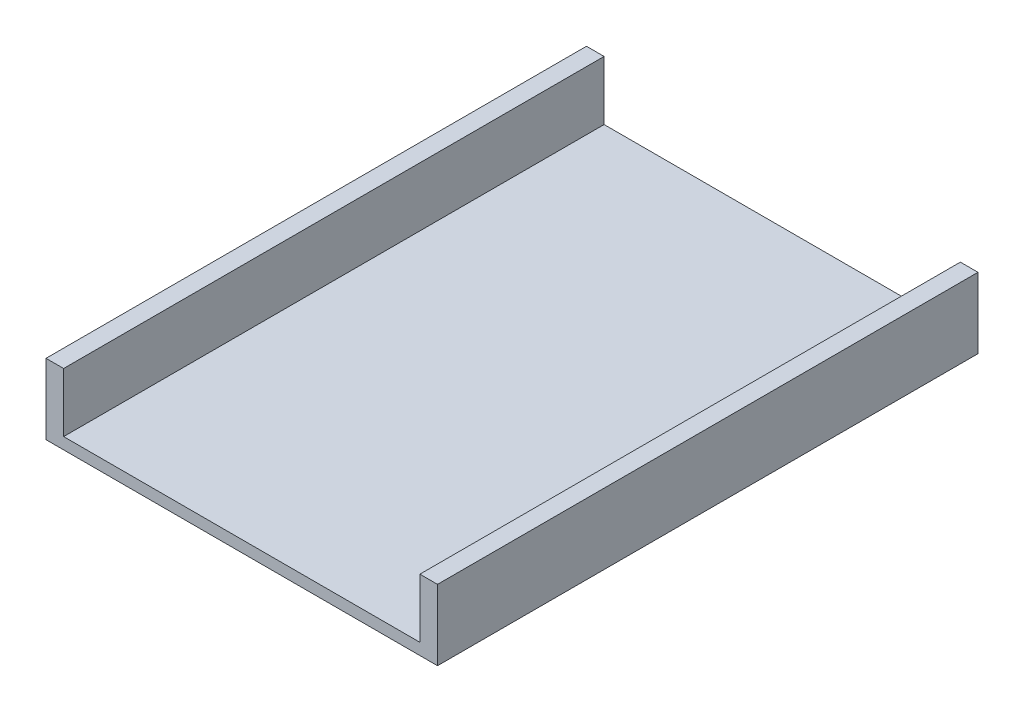
ISO-10303-21;
HEADER;
FILE_DESCRIPTION(('STEP AP214'),'2;1');
FILE_NAME('part.step','',(''),(''),'','','');
FILE_SCHEMA(('AUTOMOTIVE_DESIGN { 1 0 10303 214 1 1 1 1 }'));
ENDSEC;
DATA;
#1=APPLICATION_CONTEXT('core data for automotive mechanical design processes');
#2=APPLICATION_PROTOCOL_DEFINITION('international standard','automotive_design',2000,#1);
#3=PRODUCT_CONTEXT('',#1,'mechanical');
#4=PRODUCT('Part','Part','',(#3));
#5=PRODUCT_RELATED_PRODUCT_CATEGORY('part','',(#4));
#6=PRODUCT_DEFINITION_FORMATION('','',#4);
#7=PRODUCT_DEFINITION_CONTEXT('part definition',#1,'design');
#8=PRODUCT_DEFINITION('design','',#6,#7);
#9=PRODUCT_DEFINITION_SHAPE('','',#8);
#10=(LENGTH_UNIT() NAMED_UNIT(*) SI_UNIT(.MILLI.,.METRE.));
#11=(NAMED_UNIT(*) PLANE_ANGLE_UNIT() SI_UNIT($,.RADIAN.));
#12=(NAMED_UNIT(*) SI_UNIT($,.STERADIAN.) SOLID_ANGLE_UNIT());
#13=UNCERTAINTY_MEASURE_WITH_UNIT(LENGTH_MEASURE(1.E-05),#10,'distance_accuracy_value','');
#14=(GEOMETRIC_REPRESENTATION_CONTEXT(3) GLOBAL_UNCERTAINTY_ASSIGNED_CONTEXT((#13)) GLOBAL_UNIT_ASSIGNED_CONTEXT((#10,
#11,#12)) REPRESENTATION_CONTEXT('',''));
#15=CARTESIAN_POINT('',(0.,0.,0.));
#16=DIRECTION('',(0.,0.,1.));
#17=DIRECTION('',(1.,0.,0.));
#18=AXIS2_PLACEMENT_3D('',#15,#16,#17);
#19=CARTESIAN_POINT('',(-36.0467065868263,-19.449251497006,584.2));
#20=DIRECTION('',(1.,0.,0.));
#21=DIRECTION('',(0.,0.,-1.));
#22=AXIS2_PLACEMENT_3D('',#19,#20,#21);
#23=PLANE('',#22);
#24=DIRECTION('',(0.,-1.,0.));
#25=VECTOR('',#24,1.);
#26=CARTESIAN_POINT('',(-36.0467065868263,-19.449251497006,0.));
#27=LINE('',#26,#25);
#28=CARTESIAN_POINT('',(-36.0467065868263,56.750748502994,0.));
#29=VERTEX_POINT('',#28);
#30=CARTESIAN_POINT('',(-36.0467065868263,-19.449251497006,0.));
#31=VERTEX_POINT('',#30);
#32=EDGE_CURVE('E128',#29,#31,#27,.T.);
#33=ORIENTED_EDGE('',*,*,#32,.T.);
#34=DIRECTION('',(0.,0.,-1.));
#35=VECTOR('',#34,1.);
#36=CARTESIAN_POINT('',(-36.0467065868263,-19.449251497006,584.2));
#37=LINE('',#36,#35);
#38=CARTESIAN_POINT('',(-36.0467065868263,-19.449251497006,584.2));
#39=VERTEX_POINT('',#38);
#40=EDGE_CURVE('E11',#39,#31,#37,.T.);
#41=ORIENTED_EDGE('',*,*,#40,.F.);
#42=DIRECTION('',(0.,-1.,0.));
#43=VECTOR('',#42,1.);
#44=CARTESIAN_POINT('',(-36.0467065868263,-19.449251497006,584.2));
#45=LINE('',#44,#43);
#46=CARTESIAN_POINT('',(-36.0467065868263,56.750748502994,584.2));
#47=VERTEX_POINT('',#46);
#48=EDGE_CURVE('E142',#47,#39,#45,.T.);
#49=ORIENTED_EDGE('',*,*,#48,.F.);
#50=DIRECTION('',(0.,0.,-1.));
#51=VECTOR('',#50,1.);
#52=CARTESIAN_POINT('',(-36.0467065868263,56.750748502994,584.2));
#53=LINE('',#52,#51);
#54=EDGE_CURVE('E124',#47,#29,#53,.T.);
#55=ORIENTED_EDGE('',*,*,#54,.T.);
#56=EDGE_LOOP('',(#33,#41,#49,#55));
#57=FACE_BOUND('',#56,.T.);
#58=ADVANCED_FACE('F32',(#57),#23,.F.);
#59=CARTESIAN_POINT('',(65.3631736526946,-19.449251497006,584.2));
#60=DIRECTION('',(0.,1.,0.));
#61=DIRECTION('',(0.,0.,1.));
#62=AXIS2_PLACEMENT_3D('',#59,#60,#61);
#63=PLANE('',#62);
#64=DIRECTION('',(1.,0.,0.));
#65=VECTOR('',#64,1.);
#66=CARTESIAN_POINT('',(65.3631736526946,-19.449251497006,0.));
#67=LINE('',#66,#65);
#68=CARTESIAN_POINT('',(387.117293413174,-19.449251497006,0.));
#69=VERTEX_POINT('',#68);
#70=EDGE_CURVE('E131',#31,#69,#67,.T.);
#71=ORIENTED_EDGE('',*,*,#70,.T.);
#72=DIRECTION('',(0.,0.,-1.));
#73=VECTOR('',#72,1.);
#74=CARTESIAN_POINT('',(387.117293413174,-19.449251497006,584.2));
#75=LINE('',#74,#73);
#76=CARTESIAN_POINT('',(387.117293413174,-19.449251497006,584.2));
#77=VERTEX_POINT('',#76);
#78=EDGE_CURVE('E40',#77,#69,#75,.T.);
#79=ORIENTED_EDGE('',*,*,#78,.F.);
#80=DIRECTION('',(1.,0.,0.));
#81=VECTOR('',#80,1.);
#82=CARTESIAN_POINT('',(65.3631736526946,-19.449251497006,584.2));
#83=LINE('',#82,#81);
#84=EDGE_CURVE('E91',#39,#77,#83,.T.);
#85=ORIENTED_EDGE('',*,*,#84,.F.);
#86=ORIENTED_EDGE('',*,*,#40,.T.);
#87=EDGE_LOOP('',(#71,#79,#85,#86));
#88=FACE_BOUND('',#87,.T.);
#89=ADVANCED_FACE('F177',(#88),#63,.F.);
#90=CARTESIAN_POINT('',(387.117293413174,-19.449251497006,584.2));
#91=DIRECTION('',(-1.,0.,0.));
#92=DIRECTION('',(0.,0.,1.));
#93=AXIS2_PLACEMENT_3D('',#90,#91,#92);
#94=PLANE('',#93);
#95=DIRECTION('',(0.,1.,0.));
#96=VECTOR('',#95,1.);
#97=CARTESIAN_POINT('',(387.117293413174,-19.449251497006,0.));
#98=LINE('',#97,#96);
#99=CARTESIAN_POINT('',(387.117293413174,56.750748502994,0.));
#100=VERTEX_POINT('',#99);
#101=EDGE_CURVE('E133',#69,#100,#98,.T.);
#102=ORIENTED_EDGE('',*,*,#101,.T.);
#103=DIRECTION('',(0.,0.,-1.));
#104=VECTOR('',#103,1.);
#105=CARTESIAN_POINT('',(387.117293413174,56.750748502994,584.2));
#106=LINE('',#105,#104);
#107=CARTESIAN_POINT('',(387.117293413174,56.750748502994,584.2));
#108=VERTEX_POINT('',#107);
#109=EDGE_CURVE('E149',#108,#100,#106,.T.);
#110=ORIENTED_EDGE('',*,*,#109,.F.);
#111=DIRECTION('',(0.,1.,0.));
#112=VECTOR('',#111,1.);
#113=CARTESIAN_POINT('',(387.117293413174,-19.449251497006,584.2));
#114=LINE('',#113,#112);
#115=EDGE_CURVE('E157',#77,#108,#114,.T.);
#116=ORIENTED_EDGE('',*,*,#115,.F.);
#117=ORIENTED_EDGE('',*,*,#78,.T.);
#118=EDGE_LOOP('',(#102,#110,#116,#117));
#119=FACE_BOUND('',#118,.T.);
#120=ADVANCED_FACE('F155',(#119),#94,.F.);
#121=CARTESIAN_POINT('',(387.117293413174,56.750748502994,584.2));
#122=DIRECTION('',(0.,-1.,0.));
#123=DIRECTION('',(0.,0.,-1.));
#124=AXIS2_PLACEMENT_3D('',#121,#122,#123);
#125=PLANE('',#124);
#126=DIRECTION('',(-1.,0.,0.));
#127=VECTOR('',#126,1.);
#128=CARTESIAN_POINT('',(387.117293413174,56.750748502994,0.));
#129=LINE('',#128,#127);
#130=CARTESIAN_POINT('',(368.067293413174,56.750748502994,0.));
#131=VERTEX_POINT('',#130);
#132=EDGE_CURVE('E135',#100,#131,#129,.T.);
#133=ORIENTED_EDGE('',*,*,#132,.T.);
#134=DIRECTION('',(0.,0.,-1.));
#135=VECTOR('',#134,1.);
#136=CARTESIAN_POINT('',(368.067293413174,56.750748502994,584.2));
#137=LINE('',#136,#135);
#138=CARTESIAN_POINT('',(368.067293413174,56.750748502994,584.2));
#139=VERTEX_POINT('',#138);
#140=EDGE_CURVE('E146',#139,#131,#137,.T.);
#141=ORIENTED_EDGE('',*,*,#140,.F.);
#142=DIRECTION('',(-1.,0.,0.));
#143=VECTOR('',#142,1.);
#144=CARTESIAN_POINT('',(387.117293413174,56.750748502994,584.2));
#145=LINE('',#144,#143);
#146=EDGE_CURVE('E169',#108,#139,#145,.T.);
#147=ORIENTED_EDGE('',*,*,#146,.F.);
#148=ORIENTED_EDGE('',*,*,#109,.T.);
#149=EDGE_LOOP('',(#133,#141,#147,#148));
#150=FACE_BOUND('',#149,.T.);
#151=ADVANCED_FACE('F165',(#150),#125,.F.);
#152=CARTESIAN_POINT('',(368.067293413174,-7.00325149700598,584.2));
#153=DIRECTION('',(1.,0.,0.));
#154=DIRECTION('',(0.,0.,-1.));
#155=AXIS2_PLACEMENT_3D('',#152,#153,#154);
#156=PLANE('',#155);
#157=DIRECTION('',(0.,-1.,0.));
#158=VECTOR('',#157,1.);
#159=CARTESIAN_POINT('',(368.067293413174,-7.00325149700598,0.));
#160=LINE('',#159,#158);
#161=CARTESIAN_POINT('',(368.067293413174,-7.00325149700598,0.));
#162=VERTEX_POINT('',#161);
#163=EDGE_CURVE('E137',#131,#162,#160,.T.);
#164=ORIENTED_EDGE('',*,*,#163,.T.);
#165=DIRECTION('',(0.,0.,-1.));
#166=VECTOR('',#165,1.);
#167=CARTESIAN_POINT('',(368.067293413174,-7.00325149700598,584.2));
#168=LINE('',#167,#166);
#169=CARTESIAN_POINT('',(368.067293413174,-7.00325149700598,584.2));
#170=VERTEX_POINT('',#169);
#171=EDGE_CURVE('E119',#170,#162,#168,.T.);
#172=ORIENTED_EDGE('',*,*,#171,.F.);
#173=DIRECTION('',(0.,-1.,0.));
#174=VECTOR('',#173,1.);
#175=CARTESIAN_POINT('',(368.067293413174,-7.00325149700598,584.2));
#176=LINE('',#175,#174);
#177=EDGE_CURVE('E110',#139,#170,#176,.T.);
#178=ORIENTED_EDGE('',*,*,#177,.F.);
#179=ORIENTED_EDGE('',*,*,#140,.T.);
#180=EDGE_LOOP('',(#164,#172,#178,#179));
#181=FACE_BOUND('',#180,.T.);
#182=ADVANCED_FACE('F168',(#181),#156,.F.);
#183=CARTESIAN_POINT('',(-16.9967065868263,-7.00325149700598,584.2));
#184=DIRECTION('',(0.,-1.,0.));
#185=DIRECTION('',(0.,0.,-1.));
#186=AXIS2_PLACEMENT_3D('',#183,#184,#185);
#187=PLANE('',#186);
#188=DIRECTION('',(-1.,0.,0.));
#189=VECTOR('',#188,1.);
#190=CARTESIAN_POINT('',(-16.9967065868263,-7.00325149700598,0.));
#191=LINE('',#190,#189);
#192=CARTESIAN_POINT('',(-16.9967065868263,-7.00325149700598,0.));
#193=VERTEX_POINT('',#192);
#194=EDGE_CURVE('E118',#162,#193,#191,.T.);
#195=ORIENTED_EDGE('',*,*,#194,.T.);
#196=DIRECTION('',(0.,0.,-1.));
#197=VECTOR('',#196,1.);
#198=CARTESIAN_POINT('',(-16.9967065868263,-7.00325149700598,584.2));
#199=LINE('',#198,#197);
#200=CARTESIAN_POINT('',(-16.9967065868263,-7.00325149700598,584.2));
#201=VERTEX_POINT('',#200);
#202=EDGE_CURVE('E115',#201,#193,#199,.T.);
#203=ORIENTED_EDGE('',*,*,#202,.F.);
#204=DIRECTION('',(-1.,0.,0.));
#205=VECTOR('',#204,1.);
#206=CARTESIAN_POINT('',(-16.9967065868263,-7.00325149700598,584.2));
#207=LINE('',#206,#205);
#208=EDGE_CURVE('E104',#170,#201,#207,.T.);
#209=ORIENTED_EDGE('',*,*,#208,.F.);
#210=ORIENTED_EDGE('',*,*,#171,.T.);
#211=EDGE_LOOP('',(#195,#203,#209,#210));
#212=FACE_BOUND('',#211,.T.);
#213=ADVANCED_FACE('F116',(#212),#187,.F.);
#214=CARTESIAN_POINT('',(-16.9967065868263,56.750748502994,584.2));
#215=DIRECTION('',(-1.,0.,0.));
#216=DIRECTION('',(0.,-1.,0.));
#217=AXIS2_PLACEMENT_3D('',#214,#215,#216);
#218=PLANE('',#217);
#219=DIRECTION('',(0.,1.,0.));
#220=VECTOR('',#219,1.);
#221=CARTESIAN_POINT('',(-16.9967065868263,56.750748502994,0.));
#222=LINE('',#221,#220);
#223=CARTESIAN_POINT('',(-16.9967065868263,56.750748502994,0.));
#224=VERTEX_POINT('',#223);
#225=EDGE_CURVE('E77',#193,#224,#222,.T.);
#226=ORIENTED_EDGE('',*,*,#225,.T.);
#227=DIRECTION('',(0.,0.,-1.));
#228=VECTOR('',#227,1.);
#229=CARTESIAN_POINT('',(-16.9967065868263,56.750748502994,584.2));
#230=LINE('',#229,#228);
#231=CARTESIAN_POINT('',(-16.9967065868263,56.750748502994,584.2));
#232=VERTEX_POINT('',#231);
#233=EDGE_CURVE('E120',#232,#224,#230,.T.);
#234=ORIENTED_EDGE('',*,*,#233,.F.);
#235=DIRECTION('',(0.,1.,0.));
#236=VECTOR('',#235,1.);
#237=CARTESIAN_POINT('',(-16.9967065868263,56.750748502994,584.2));
#238=LINE('',#237,#236);
#239=EDGE_CURVE('E108',#201,#232,#238,.T.);
#240=ORIENTED_EDGE('',*,*,#239,.F.);
#241=ORIENTED_EDGE('',*,*,#202,.T.);
#242=EDGE_LOOP('',(#226,#234,#240,#241));
#243=FACE_BOUND('',#242,.T.);
#244=ADVANCED_FACE('F122',(#243),#218,.F.);
#245=CARTESIAN_POINT('',(-36.0467065868263,56.750748502994,584.2));
#246=DIRECTION('',(0.,-1.,0.));
#247=DIRECTION('',(0.,0.,-1.));
#248=AXIS2_PLACEMENT_3D('',#245,#246,#247);
#249=PLANE('',#248);
#250=DIRECTION('',(-1.,0.,0.));
#251=VECTOR('',#250,1.);
#252=CARTESIAN_POINT('',(-36.0467065868263,56.750748502994,0.));
#253=LINE('',#252,#251);
#254=EDGE_CURVE('E83',#224,#29,#253,.T.);
#255=ORIENTED_EDGE('',*,*,#254,.T.);
#256=ORIENTED_EDGE('',*,*,#54,.F.);
#257=DIRECTION('',(-1.,0.,0.));
#258=VECTOR('',#257,1.);
#259=CARTESIAN_POINT('',(-36.0467065868263,56.750748502994,584.2));
#260=LINE('',#259,#258);
#261=EDGE_CURVE('E48',#232,#47,#260,.T.);
#262=ORIENTED_EDGE('',*,*,#261,.F.);
#263=ORIENTED_EDGE('',*,*,#233,.T.);
#264=EDGE_LOOP('',(#255,#256,#262,#263));
#265=FACE_BOUND('',#264,.T.);
#266=ADVANCED_FACE('F193',(#265),#249,.F.);
#267=CARTESIAN_POINT('',(0.,0.,584.2));
#268=DIRECTION('',(0.,0.,-1.));
#269=DIRECTION('',(-1.,0.,0.));
#270=AXIS2_PLACEMENT_3D('',#267,#268,#269);
#271=PLANE('',#270);
#272=ORIENTED_EDGE('',*,*,#48,.T.);
#273=ORIENTED_EDGE('',*,*,#84,.T.);
#274=ORIENTED_EDGE('',*,*,#115,.T.);
#275=ORIENTED_EDGE('',*,*,#146,.T.);
#276=ORIENTED_EDGE('',*,*,#177,.T.);
#277=ORIENTED_EDGE('',*,*,#208,.T.);
#278=ORIENTED_EDGE('',*,*,#239,.T.);
#279=ORIENTED_EDGE('',*,*,#261,.T.);
#280=EDGE_LOOP('',(#272,#273,#274,#275,#276,#277,#278,#279));
#281=FACE_BOUND('',#280,.T.);
#282=ADVANCED_FACE('F106',(#281),#271,.F.);
#283=CARTESIAN_POINT('',(0.,0.,0.));
#284=DIRECTION('',(0.,0.,-1.));
#285=DIRECTION('',(-1.,0.,0.));
#286=AXIS2_PLACEMENT_3D('',#283,#284,#285);
#287=PLANE('',#286);
#288=ORIENTED_EDGE('',*,*,#32,.F.);
#289=ORIENTED_EDGE('',*,*,#254,.F.);
#290=ORIENTED_EDGE('',*,*,#225,.F.);
#291=ORIENTED_EDGE('',*,*,#194,.F.);
#292=ORIENTED_EDGE('',*,*,#163,.F.);
#293=ORIENTED_EDGE('',*,*,#132,.F.);
#294=ORIENTED_EDGE('',*,*,#101,.F.);
#295=ORIENTED_EDGE('',*,*,#70,.F.);
#296=EDGE_LOOP('',(#288,#289,#290,#291,#292,#293,#294,#295));
#297=FACE_BOUND('',#296,.T.);
#298=ADVANCED_FACE('F161',(#297),#287,.T.);
#299=CLOSED_SHELL('',(#58,#89,#120,#151,#182,#213,#244,#266,#282,#298));
#300=MANIFOLD_SOLID_BREP('B2',#299);
#301=ADVANCED_BREP_SHAPE_REPRESENTATION('',(#18,#300),#14);
#302=SHAPE_DEFINITION_REPRESENTATION(#9,#301);
ENDSEC;
END-ISO-10303-21;
